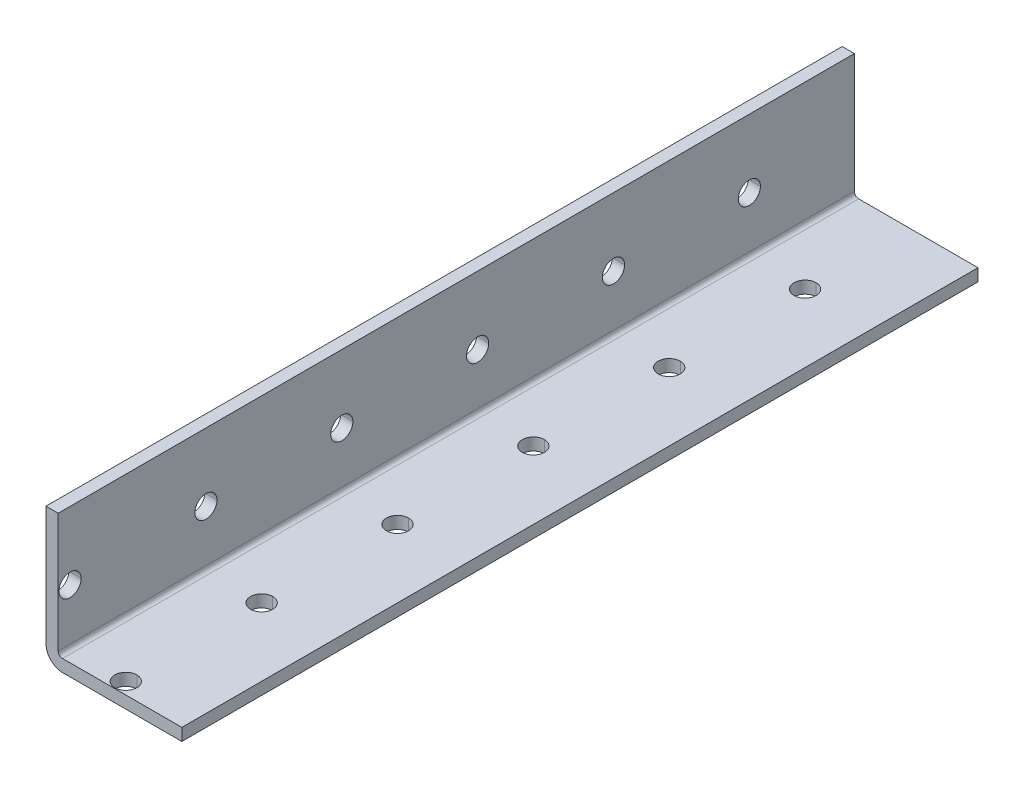
ISO-10303-21;
HEADER;
FILE_DESCRIPTION(('STEP AP214'),'2;1');
FILE_NAME('part.step','',(''),(''),'','','');
FILE_SCHEMA(('AUTOMOTIVE_DESIGN { 1 0 10303 214 1 1 1 1 }'));
ENDSEC;
DATA;
#1=APPLICATION_CONTEXT('core data for automotive mechanical design processes');
#2=APPLICATION_PROTOCOL_DEFINITION('international standard','automotive_design',2000,#1);
#3=PRODUCT_CONTEXT('',#1,'mechanical');
#4=PRODUCT('Part','Part','',(#3));
#5=PRODUCT_RELATED_PRODUCT_CATEGORY('part','',(#4));
#6=PRODUCT_DEFINITION_FORMATION('','',#4);
#7=PRODUCT_DEFINITION_CONTEXT('part definition',#1,'design');
#8=PRODUCT_DEFINITION('design','',#6,#7);
#9=PRODUCT_DEFINITION_SHAPE('','',#8);
#10=(LENGTH_UNIT() NAMED_UNIT(*) SI_UNIT(.MILLI.,.METRE.));
#11=(NAMED_UNIT(*) PLANE_ANGLE_UNIT() SI_UNIT($,.RADIAN.));
#12=(NAMED_UNIT(*) SI_UNIT($,.STERADIAN.) SOLID_ANGLE_UNIT());
#13=UNCERTAINTY_MEASURE_WITH_UNIT(LENGTH_MEASURE(1.E-05),#10,'distance_accuracy_value','');
#14=(GEOMETRIC_REPRESENTATION_CONTEXT(3) GLOBAL_UNCERTAINTY_ASSIGNED_CONTEXT((#13)) GLOBAL_UNIT_ASSIGNED_CONTEXT((#10,
#11,#12)) REPRESENTATION_CONTEXT('',''));
#15=CARTESIAN_POINT('',(0.,0.,0.));
#16=DIRECTION('',(0.,0.,1.));
#17=DIRECTION('',(1.,0.,0.));
#18=AXIS2_PLACEMENT_3D('',#15,#16,#17);
#19=CARTESIAN_POINT('',(0.,0.,749.3));
#20=DIRECTION('',(0.,-1.,0.));
#21=DIRECTION('',(0.,0.,1.));
#22=AXIS2_PLACEMENT_3D('',#19,#20,#21);
#23=PLANE('',#22);
#24=CARTESIAN_POINT('',(12.7,0.,609.6));
#25=DIRECTION('',(0.,1.,0.));
#26=DIRECTION('',(0.,0.,1.));
#27=AXIS2_PLACEMENT_3D('',#24,#25,#26);
#28=CIRCLE('',#27,2.07009999999996);
#29=CARTESIAN_POINT('',(12.7,0.,611.6701));
#30=VERTEX_POINT('',#29);
#31=CARTESIAN_POINT('',(12.7,0.,607.5299));
#32=VERTEX_POINT('',#31);
#33=EDGE_CURVE('E449',#30,#32,#28,.T.);
#34=ORIENTED_EDGE('',*,*,#33,.T.);
#35=CARTESIAN_POINT('',(12.7,0.,609.6));
#36=DIRECTION('',(0.,1.,0.));
#37=DIRECTION('',(0.,0.,1.));
#38=AXIS2_PLACEMENT_3D('',#35,#36,#37);
#39=CIRCLE('',#38,2.07009999999996);
#40=EDGE_CURVE('E402',#32,#30,#39,.T.);
#41=ORIENTED_EDGE('',*,*,#40,.T.);
#42=EDGE_LOOP('',(#34,#41));
#43=FACE_BOUND('',#42,.T.);
#44=CARTESIAN_POINT('',(12.7,0.,635.));
#45=DIRECTION('',(0.,1.,0.));
#46=DIRECTION('',(0.,0.,1.));
#47=AXIS2_PLACEMENT_3D('',#44,#45,#46);
#48=CIRCLE('',#47,2.07009999999996);
#49=CARTESIAN_POINT('',(12.7,0.,637.0701));
#50=VERTEX_POINT('',#49);
#51=CARTESIAN_POINT('',(12.7,0.,632.9299));
#52=VERTEX_POINT('',#51);
#53=EDGE_CURVE('E595',#50,#52,#48,.T.);
#54=ORIENTED_EDGE('',*,*,#53,.T.);
#55=CARTESIAN_POINT('',(12.7,0.,635.));
#56=DIRECTION('',(0.,1.,0.));
#57=DIRECTION('',(0.,0.,1.));
#58=AXIS2_PLACEMENT_3D('',#55,#56,#57);
#59=CIRCLE('',#58,2.07009999999996);
#60=EDGE_CURVE('E336',#52,#50,#59,.T.);
#61=ORIENTED_EDGE('',*,*,#60,.T.);
#62=EDGE_LOOP('',(#54,#61));
#63=FACE_BOUND('',#62,.T.);
#64=CARTESIAN_POINT('',(12.7,0.,660.4));
#65=DIRECTION('',(0.,1.,0.));
#66=DIRECTION('',(0.,0.,1.));
#67=AXIS2_PLACEMENT_3D('',#64,#65,#66);
#68=CIRCLE('',#67,2.07009999999996);
#69=CARTESIAN_POINT('',(12.7,0.,662.4701));
#70=VERTEX_POINT('',#69);
#71=CARTESIAN_POINT('',(12.7,0.,658.3299));
#72=VERTEX_POINT('',#71);
#73=EDGE_CURVE('E559',#70,#72,#68,.T.);
#74=ORIENTED_EDGE('',*,*,#73,.T.);
#75=CARTESIAN_POINT('',(12.7,0.,660.4));
#76=DIRECTION('',(0.,1.,0.));
#77=DIRECTION('',(0.,0.,1.));
#78=AXIS2_PLACEMENT_3D('',#75,#76,#77);
#79=CIRCLE('',#78,2.07009999999996);
#80=EDGE_CURVE('E434',#72,#70,#79,.T.);
#81=ORIENTED_EDGE('',*,*,#80,.T.);
#82=EDGE_LOOP('',(#74,#81));
#83=FACE_BOUND('',#82,.T.);
#84=CARTESIAN_POINT('',(12.7,0.,685.8));
#85=DIRECTION('',(0.,1.,0.));
#86=DIRECTION('',(0.,0.,1.));
#87=AXIS2_PLACEMENT_3D('',#84,#85,#86);
#88=CIRCLE('',#87,2.07009999999996);
#89=CARTESIAN_POINT('',(12.7,0.,687.8701));
#90=VERTEX_POINT('',#89);
#91=CARTESIAN_POINT('',(12.7,0.,683.7299));
#92=VERTEX_POINT('',#91);
#93=EDGE_CURVE('E560',#90,#92,#88,.T.);
#94=ORIENTED_EDGE('',*,*,#93,.T.);
#95=CARTESIAN_POINT('',(12.7,0.,685.8));
#96=DIRECTION('',(0.,1.,0.));
#97=DIRECTION('',(0.,0.,1.));
#98=AXIS2_PLACEMENT_3D('',#95,#96,#97);
#99=CIRCLE('',#98,2.07009999999996);
#100=EDGE_CURVE('E508',#92,#90,#99,.T.);
#101=ORIENTED_EDGE('',*,*,#100,.T.);
#102=EDGE_LOOP('',(#94,#101));
#103=FACE_BOUND('',#102,.T.);
#104=CARTESIAN_POINT('',(12.7,0.,711.2));
#105=DIRECTION('',(0.,1.,0.));
#106=DIRECTION('',(0.,0.,1.));
#107=AXIS2_PLACEMENT_3D('',#104,#105,#106);
#108=CIRCLE('',#107,2.07009999999996);
#109=CARTESIAN_POINT('',(12.7,0.,713.2701));
#110=VERTEX_POINT('',#109);
#111=CARTESIAN_POINT('',(12.7,0.,709.1299));
#112=VERTEX_POINT('',#111);
#113=EDGE_CURVE('E563',#110,#112,#108,.T.);
#114=ORIENTED_EDGE('',*,*,#113,.T.);
#115=CARTESIAN_POINT('',(12.7,0.,711.2));
#116=DIRECTION('',(0.,1.,0.));
#117=DIRECTION('',(0.,0.,1.));
#118=AXIS2_PLACEMENT_3D('',#115,#116,#117);
#119=CIRCLE('',#118,2.07009999999996);
#120=EDGE_CURVE('E428',#112,#110,#119,.T.);
#121=ORIENTED_EDGE('',*,*,#120,.T.);
#122=EDGE_LOOP('',(#114,#121));
#123=FACE_BOUND('',#122,.T.);
#124=CARTESIAN_POINT('',(12.7,0.,736.6));
#125=DIRECTION('',(0.,1.,0.));
#126=DIRECTION('',(0.,0.,1.));
#127=AXIS2_PLACEMENT_3D('',#124,#125,#126);
#128=CIRCLE('',#127,2.07009999999996);
#129=CARTESIAN_POINT('',(12.7,0.,738.6701));
#130=VERTEX_POINT('',#129);
#131=CARTESIAN_POINT('',(12.7,0.,734.5299));
#132=VERTEX_POINT('',#131);
#133=EDGE_CURVE('E519',#130,#132,#128,.T.);
#134=ORIENTED_EDGE('',*,*,#133,.T.);
#135=CARTESIAN_POINT('',(12.7,0.,736.6));
#136=DIRECTION('',(0.,1.,0.));
#137=DIRECTION('',(0.,0.,1.));
#138=AXIS2_PLACEMENT_3D('',#135,#136,#137);
#139=CIRCLE('',#138,2.07009999999996);
#140=EDGE_CURVE('E341',#132,#130,#139,.T.);
#141=ORIENTED_EDGE('',*,*,#140,.T.);
#142=EDGE_LOOP('',(#134,#141));
#143=FACE_BOUND('',#142,.T.);
#144=DIRECTION('',(0.,0.,-1.));
#145=VECTOR('',#144,1.);
#146=CARTESIAN_POINT('',(3.0988,0.,749.3));
#147=LINE('',#146,#145);
#148=CARTESIAN_POINT('',(3.0988,0.,738.81488));
#149=VERTEX_POINT('',#148);
#150=CARTESIAN_POINT('',(3.0988,0.,589.97088));
#151=VERTEX_POINT('',#150);
#152=EDGE_CURVE('E322',#149,#151,#147,.T.);
#153=ORIENTED_EDGE('',*,*,#152,.T.);
#154=DIRECTION('',(-1.,0.,0.));
#155=VECTOR('',#154,1.);
#156=CARTESIAN_POINT('',(0.,0.,589.97088));
#157=LINE('',#156,#155);
#158=CARTESIAN_POINT('',(25.4,0.,589.97088));
#159=VERTEX_POINT('',#158);
#160=EDGE_CURVE('E319',#159,#151,#157,.T.);
#161=ORIENTED_EDGE('',*,*,#160,.F.);
#162=DIRECTION('',(0.,0.,-1.));
#163=VECTOR('',#162,1.);
#164=CARTESIAN_POINT('',(25.4,0.,749.3));
#165=LINE('',#164,#163);
#166=CARTESIAN_POINT('',(25.4,0.,738.81488));
#167=VERTEX_POINT('',#166);
#168=EDGE_CURVE('E304',#167,#159,#165,.T.);
#169=ORIENTED_EDGE('',*,*,#168,.F.);
#170=DIRECTION('',(1.,0.,0.));
#171=VECTOR('',#170,1.);
#172=CARTESIAN_POINT('',(0.,0.,738.81488));
#173=LINE('',#172,#171);
#174=EDGE_CURVE('E310',#149,#167,#173,.T.);
#175=ORIENTED_EDGE('',*,*,#174,.F.);
#176=EDGE_LOOP('',(#153,#161,#169,#175));
#177=FACE_BOUND('',#176,.T.);
#178=ADVANCED_FACE('F50',(#43,#63,#83,#103,#123,#143,#177),#23,.T.);
#179=CARTESIAN_POINT('',(3.0988,3.0988,749.3));
#180=DIRECTION('',(0.,0.,-1.));
#181=DIRECTION('',(1.,0.,0.));
#182=AXIS2_PLACEMENT_3D('',#179,#180,#181);
#183=CYLINDRICAL_SURFACE('',#182,3.0988);
#184=DIRECTION('',(0.,0.,-1.));
#185=VECTOR('',#184,1.);
#186=CARTESIAN_POINT('',(0.,3.0988,749.3));
#187=LINE('',#186,#185);
#188=CARTESIAN_POINT('',(0.,3.0988,738.81488));
#189=VERTEX_POINT('',#188);
#190=CARTESIAN_POINT('',(0.,3.0988,589.97088));
#191=VERTEX_POINT('',#190);
#192=EDGE_CURVE('E332',#189,#191,#187,.T.);
#193=ORIENTED_EDGE('',*,*,#192,.T.);
#194=CARTESIAN_POINT('',(3.0988,3.0988,589.97088));
#195=DIRECTION('',(0.,0.,1.));
#196=DIRECTION('',(1.,0.,0.));
#197=AXIS2_PLACEMENT_3D('',#194,#195,#196);
#198=CIRCLE('',#197,3.0988);
#199=EDGE_CURVE('E1256',#151,#191,#198,.F.);
#200=ORIENTED_EDGE('',*,*,#199,.F.);
#201=ORIENTED_EDGE('',*,*,#152,.F.);
#202=CARTESIAN_POINT('',(3.0988,3.0988,738.81488));
#203=DIRECTION('',(0.,0.,-1.));
#204=DIRECTION('',(-1.,0.,0.));
#205=AXIS2_PLACEMENT_3D('',#202,#203,#204);
#206=CIRCLE('',#205,3.0988);
#207=EDGE_CURVE('E313',#189,#149,#206,.F.);
#208=ORIENTED_EDGE('',*,*,#207,.F.);
#209=EDGE_LOOP('',(#193,#200,#201,#208));
#210=FACE_BOUND('',#209,.T.);
#211=ADVANCED_FACE('F1178',(#210),#183,.T.);
#212=CARTESIAN_POINT('',(0.,0.,749.3));
#213=DIRECTION('',(-1.,0.,0.));
#214=DIRECTION('',(0.,0.,-1.));
#215=AXIS2_PLACEMENT_3D('',#212,#213,#214);
#216=PLANE('',#215);
#217=CARTESIAN_POINT('',(0.,12.7,736.6));
#218=DIRECTION('',(1.,0.,0.));
#219=DIRECTION('',(0.,0.,-1.));
#220=AXIS2_PLACEMENT_3D('',#217,#218,#219);
#221=CIRCLE('',#220,2.07009999999996);
#222=CARTESIAN_POINT('',(0.,12.7,734.5299));
#223=VERTEX_POINT('',#222);
#224=CARTESIAN_POINT('',(0.,12.7,738.6701));
#225=VERTEX_POINT('',#224);
#226=EDGE_CURVE('E448',#223,#225,#221,.T.);
#227=ORIENTED_EDGE('',*,*,#226,.T.);
#228=CARTESIAN_POINT('',(0.,12.7,736.6));
#229=DIRECTION('',(1.,0.,0.));
#230=DIRECTION('',(0.,0.,-1.));
#231=AXIS2_PLACEMENT_3D('',#228,#229,#230);
#232=CIRCLE('',#231,2.07009999999996);
#233=EDGE_CURVE('E387',#225,#223,#232,.T.);
#234=ORIENTED_EDGE('',*,*,#233,.T.);
#235=EDGE_LOOP('',(#227,#234));
#236=FACE_BOUND('',#235,.T.);
#237=CARTESIAN_POINT('',(0.,12.7,711.2));
#238=DIRECTION('',(1.,0.,0.));
#239=DIRECTION('',(0.,0.,-1.));
#240=AXIS2_PLACEMENT_3D('',#237,#238,#239);
#241=CIRCLE('',#240,2.07009999999996);
#242=CARTESIAN_POINT('',(0.,12.7,709.1299));
#243=VERTEX_POINT('',#242);
#244=CARTESIAN_POINT('',(0.,12.7,713.2701));
#245=VERTEX_POINT('',#244);
#246=EDGE_CURVE('E447',#243,#245,#241,.T.);
#247=ORIENTED_EDGE('',*,*,#246,.T.);
#248=CARTESIAN_POINT('',(0.,12.7,711.2));
#249=DIRECTION('',(1.,0.,0.));
#250=DIRECTION('',(0.,0.,-1.));
#251=AXIS2_PLACEMENT_3D('',#248,#249,#250);
#252=CIRCLE('',#251,2.07009999999996);
#253=EDGE_CURVE('E472',#245,#243,#252,.T.);
#254=ORIENTED_EDGE('',*,*,#253,.T.);
#255=EDGE_LOOP('',(#247,#254));
#256=FACE_BOUND('',#255,.T.);
#257=CARTESIAN_POINT('',(0.,12.7,685.8));
#258=DIRECTION('',(1.,0.,0.));
#259=DIRECTION('',(0.,0.,-1.));
#260=AXIS2_PLACEMENT_3D('',#257,#258,#259);
#261=CIRCLE('',#260,2.07009999999996);
#262=CARTESIAN_POINT('',(0.,12.7,683.7299));
#263=VERTEX_POINT('',#262);
#264=CARTESIAN_POINT('',(0.,12.7,687.8701));
#265=VERTEX_POINT('',#264);
#266=EDGE_CURVE('E354',#263,#265,#261,.T.);
#267=ORIENTED_EDGE('',*,*,#266,.T.);
#268=CARTESIAN_POINT('',(0.,12.7,685.8));
#269=DIRECTION('',(1.,0.,0.));
#270=DIRECTION('',(0.,0.,-1.));
#271=AXIS2_PLACEMENT_3D('',#268,#269,#270);
#272=CIRCLE('',#271,2.07009999999996);
#273=EDGE_CURVE('E540',#265,#263,#272,.T.);
#274=ORIENTED_EDGE('',*,*,#273,.T.);
#275=EDGE_LOOP('',(#267,#274));
#276=FACE_BOUND('',#275,.T.);
#277=CARTESIAN_POINT('',(0.,12.7,660.4));
#278=DIRECTION('',(1.,0.,0.));
#279=DIRECTION('',(0.,0.,-1.));
#280=AXIS2_PLACEMENT_3D('',#277,#278,#279);
#281=CIRCLE('',#280,2.07009999999996);
#282=CARTESIAN_POINT('',(0.,12.7,658.3299));
#283=VERTEX_POINT('',#282);
#284=CARTESIAN_POINT('',(0.,12.7,662.4701));
#285=VERTEX_POINT('',#284);
#286=EDGE_CURVE('E395',#283,#285,#281,.T.);
#287=ORIENTED_EDGE('',*,*,#286,.T.);
#288=CARTESIAN_POINT('',(0.,12.7,660.4));
#289=DIRECTION('',(1.,0.,0.));
#290=DIRECTION('',(0.,0.,-1.));
#291=AXIS2_PLACEMENT_3D('',#288,#289,#290);
#292=CIRCLE('',#291,2.07009999999996);
#293=EDGE_CURVE('E495',#285,#283,#292,.T.);
#294=ORIENTED_EDGE('',*,*,#293,.T.);
#295=EDGE_LOOP('',(#287,#294));
#296=FACE_BOUND('',#295,.T.);
#297=CARTESIAN_POINT('',(0.,12.7,635.));
#298=DIRECTION('',(1.,0.,0.));
#299=DIRECTION('',(0.,0.,-1.));
#300=AXIS2_PLACEMENT_3D('',#297,#298,#299);
#301=CIRCLE('',#300,2.07009999999996);
#302=CARTESIAN_POINT('',(0.,12.7,632.9299));
#303=VERTEX_POINT('',#302);
#304=CARTESIAN_POINT('',(0.,12.7,637.0701));
#305=VERTEX_POINT('',#304);
#306=EDGE_CURVE('E348',#303,#305,#301,.T.);
#307=ORIENTED_EDGE('',*,*,#306,.T.);
#308=CARTESIAN_POINT('',(0.,12.7,635.));
#309=DIRECTION('',(1.,0.,0.));
#310=DIRECTION('',(0.,0.,-1.));
#311=AXIS2_PLACEMENT_3D('',#308,#309,#310);
#312=CIRCLE('',#311,2.07009999999996);
#313=EDGE_CURVE('E429',#305,#303,#312,.T.);
#314=ORIENTED_EDGE('',*,*,#313,.T.);
#315=EDGE_LOOP('',(#307,#314));
#316=FACE_BOUND('',#315,.T.);
#317=CARTESIAN_POINT('',(0.,12.7,609.6));
#318=DIRECTION('',(1.,0.,0.));
#319=DIRECTION('',(0.,0.,-1.));
#320=AXIS2_PLACEMENT_3D('',#317,#318,#319);
#321=CIRCLE('',#320,2.07009999999996);
#322=CARTESIAN_POINT('',(0.,12.7,607.5299));
#323=VERTEX_POINT('',#322);
#324=CARTESIAN_POINT('',(0.,12.7,611.6701));
#325=VERTEX_POINT('',#324);
#326=EDGE_CURVE('E420',#323,#325,#321,.T.);
#327=ORIENTED_EDGE('',*,*,#326,.T.);
#328=CARTESIAN_POINT('',(0.,12.7,609.6));
#329=DIRECTION('',(1.,0.,0.));
#330=DIRECTION('',(0.,0.,-1.));
#331=AXIS2_PLACEMENT_3D('',#328,#329,#330);
#332=CIRCLE('',#331,2.07009999999996);
#333=EDGE_CURVE('E321',#325,#323,#332,.T.);
#334=ORIENTED_EDGE('',*,*,#333,.T.);
#335=EDGE_LOOP('',(#327,#334));
#336=FACE_BOUND('',#335,.T.);
#337=DIRECTION('',(0.,0.,-1.));
#338=VECTOR('',#337,1.);
#339=CARTESIAN_POINT('',(0.,25.4,749.3));
#340=LINE('',#339,#338);
#341=CARTESIAN_POINT('',(0.,25.4,738.81488));
#342=VERTEX_POINT('',#341);
#343=CARTESIAN_POINT('',(0.,25.4,589.97088));
#344=VERTEX_POINT('',#343);
#345=EDGE_CURVE('E464',#342,#344,#340,.T.);
#346=ORIENTED_EDGE('',*,*,#345,.T.);
#347=DIRECTION('',(0.,1.,0.));
#348=VECTOR('',#347,1.);
#349=CARTESIAN_POINT('',(0.,0.,589.97088));
#350=LINE('',#349,#348);
#351=EDGE_CURVE('E1253',#191,#344,#350,.T.);
#352=ORIENTED_EDGE('',*,*,#351,.F.);
#353=ORIENTED_EDGE('',*,*,#192,.F.);
#354=DIRECTION('',(0.,-1.,0.));
#355=VECTOR('',#354,1.);
#356=CARTESIAN_POINT('',(0.,0.,738.81488));
#357=LINE('',#356,#355);
#358=EDGE_CURVE('E1240',#342,#189,#357,.T.);
#359=ORIENTED_EDGE('',*,*,#358,.F.);
#360=EDGE_LOOP('',(#346,#352,#353,#359));
#361=FACE_BOUND('',#360,.T.);
#362=ADVANCED_FACE('F1183',(#236,#256,#276,#296,#316,#336,#361),#216,.T.);
#363=CARTESIAN_POINT('',(0.,25.4,749.3));
#364=DIRECTION('',(0.,-1.,0.));
#365=DIRECTION('',(0.,0.,1.));
#366=AXIS2_PLACEMENT_3D('',#363,#364,#365);
#367=PLANE('',#366);
#368=DIRECTION('',(1.,0.,0.));
#369=VECTOR('',#368,1.);
#370=CARTESIAN_POINT('',(0.,25.4,738.81488));
#371=LINE('',#370,#369);
#372=CARTESIAN_POINT('',(2.286,25.4,738.81488));
#373=VERTEX_POINT('',#372);
#374=EDGE_CURVE('E1237',#342,#373,#371,.T.);
#375=ORIENTED_EDGE('',*,*,#374,.T.);
#376=DIRECTION('',(0.,0.,-1.));
#377=VECTOR('',#376,1.);
#378=CARTESIAN_POINT('',(2.286,25.4,749.3));
#379=LINE('',#378,#377);
#380=CARTESIAN_POINT('',(2.286,25.4,589.97088));
#381=VERTEX_POINT('',#380);
#382=EDGE_CURVE('E468',#373,#381,#379,.T.);
#383=ORIENTED_EDGE('',*,*,#382,.T.);
#384=DIRECTION('',(-1.,0.,0.));
#385=VECTOR('',#384,1.);
#386=CARTESIAN_POINT('',(0.,25.4,589.97088));
#387=LINE('',#386,#385);
#388=EDGE_CURVE('E1251',#381,#344,#387,.T.);
#389=ORIENTED_EDGE('',*,*,#388,.T.);
#390=ORIENTED_EDGE('',*,*,#345,.F.);
#391=EDGE_LOOP('',(#375,#383,#389,#390));
#392=FACE_BOUND('',#391,.T.);
#393=ADVANCED_FACE('F1206',(#392),#367,.F.);
#394=CARTESIAN_POINT('',(2.286,0.,749.3));
#395=DIRECTION('',(-1.,0.,0.));
#396=DIRECTION('',(0.,0.,-1.));
#397=AXIS2_PLACEMENT_3D('',#394,#395,#396);
#398=PLANE('',#397);
#399=CARTESIAN_POINT('',(2.286,12.7,609.6));
#400=DIRECTION('',(1.,0.,0.));
#401=DIRECTION('',(0.,0.,-1.));
#402=AXIS2_PLACEMENT_3D('',#399,#400,#401);
#403=CIRCLE('',#402,2.07009999999996);
#404=CARTESIAN_POINT('',(2.286,12.7,607.5299));
#405=VERTEX_POINT('',#404);
#406=CARTESIAN_POINT('',(2.286,12.7,611.6701));
#407=VERTEX_POINT('',#406);
#408=EDGE_CURVE('E530',#405,#407,#403,.T.);
#409=ORIENTED_EDGE('',*,*,#408,.F.);
#410=CARTESIAN_POINT('',(2.286,12.7,609.6));
#411=DIRECTION('',(1.,0.,0.));
#412=DIRECTION('',(0.,0.,-1.));
#413=AXIS2_PLACEMENT_3D('',#410,#411,#412);
#414=CIRCLE('',#413,2.07009999999996);
#415=EDGE_CURVE('E526',#407,#405,#414,.T.);
#416=ORIENTED_EDGE('',*,*,#415,.F.);
#417=EDGE_LOOP('',(#409,#416));
#418=FACE_BOUND('',#417,.T.);
#419=CARTESIAN_POINT('',(2.286,12.7,635.));
#420=DIRECTION('',(1.,0.,0.));
#421=DIRECTION('',(0.,0.,-1.));
#422=AXIS2_PLACEMENT_3D('',#419,#420,#421);
#423=CIRCLE('',#422,2.07009999999996);
#424=CARTESIAN_POINT('',(2.286,12.7,632.9299));
#425=VERTEX_POINT('',#424);
#426=CARTESIAN_POINT('',(2.286,12.7,637.0701));
#427=VERTEX_POINT('',#426);
#428=EDGE_CURVE('E376',#425,#427,#423,.T.);
#429=ORIENTED_EDGE('',*,*,#428,.F.);
#430=CARTESIAN_POINT('',(2.286,12.7,635.));
#431=DIRECTION('',(1.,0.,0.));
#432=DIRECTION('',(0.,0.,-1.));
#433=AXIS2_PLACEMENT_3D('',#430,#431,#432);
#434=CIRCLE('',#433,2.07009999999996);
#435=EDGE_CURVE('E372',#427,#425,#434,.T.);
#436=ORIENTED_EDGE('',*,*,#435,.F.);
#437=EDGE_LOOP('',(#429,#436));
#438=FACE_BOUND('',#437,.T.);
#439=CARTESIAN_POINT('',(2.286,12.7,660.4));
#440=DIRECTION('',(1.,0.,0.));
#441=DIRECTION('',(0.,0.,-1.));
#442=AXIS2_PLACEMENT_3D('',#439,#440,#441);
#443=CIRCLE('',#442,2.07009999999996);
#444=CARTESIAN_POINT('',(2.286,12.7,658.3299));
#445=VERTEX_POINT('',#444);
#446=CARTESIAN_POINT('',(2.286,12.7,662.4701));
#447=VERTEX_POINT('',#446);
#448=EDGE_CURVE('E377',#445,#447,#443,.T.);
#449=ORIENTED_EDGE('',*,*,#448,.F.);
#450=CARTESIAN_POINT('',(2.286,12.7,660.4));
#451=DIRECTION('',(1.,0.,0.));
#452=DIRECTION('',(0.,0.,-1.));
#453=AXIS2_PLACEMENT_3D('',#450,#451,#452);
#454=CIRCLE('',#453,2.07009999999996);
#455=EDGE_CURVE('E443',#447,#445,#454,.T.);
#456=ORIENTED_EDGE('',*,*,#455,.F.);
#457=EDGE_LOOP('',(#449,#456));
#458=FACE_BOUND('',#457,.T.);
#459=CARTESIAN_POINT('',(2.286,12.7,685.8));
#460=DIRECTION('',(1.,0.,0.));
#461=DIRECTION('',(0.,0.,-1.));
#462=AXIS2_PLACEMENT_3D('',#459,#460,#461);
#463=CIRCLE('',#462,2.07009999999996);
#464=CARTESIAN_POINT('',(2.286,12.7,683.7299));
#465=VERTEX_POINT('',#464);
#466=CARTESIAN_POINT('',(2.286,12.7,687.8701));
#467=VERTEX_POINT('',#466);
#468=EDGE_CURVE('E455',#465,#467,#463,.T.);
#469=ORIENTED_EDGE('',*,*,#468,.F.);
#470=CARTESIAN_POINT('',(2.286,12.7,685.8));
#471=DIRECTION('',(1.,0.,0.));
#472=DIRECTION('',(0.,0.,-1.));
#473=AXIS2_PLACEMENT_3D('',#470,#471,#472);
#474=CIRCLE('',#473,2.07009999999996);
#475=EDGE_CURVE('E459',#467,#465,#474,.T.);
#476=ORIENTED_EDGE('',*,*,#475,.F.);
#477=EDGE_LOOP('',(#469,#476));
#478=FACE_BOUND('',#477,.T.);
#479=CARTESIAN_POINT('',(2.286,12.7,711.2));
#480=DIRECTION('',(1.,0.,0.));
#481=DIRECTION('',(0.,0.,-1.));
#482=AXIS2_PLACEMENT_3D('',#479,#480,#481);
#483=CIRCLE('',#482,2.07009999999996);
#484=CARTESIAN_POINT('',(2.286,12.7,709.1299));
#485=VERTEX_POINT('',#484);
#486=CARTESIAN_POINT('',(2.286,12.7,713.2701));
#487=VERTEX_POINT('',#486);
#488=EDGE_CURVE('E494',#485,#487,#483,.T.);
#489=ORIENTED_EDGE('',*,*,#488,.F.);
#490=CARTESIAN_POINT('',(2.286,12.7,711.2));
#491=DIRECTION('',(1.,0.,0.));
#492=DIRECTION('',(0.,0.,-1.));
#493=AXIS2_PLACEMENT_3D('',#490,#491,#492);
#494=CIRCLE('',#493,2.07009999999996);
#495=EDGE_CURVE('E364',#487,#485,#494,.T.);
#496=ORIENTED_EDGE('',*,*,#495,.F.);
#497=EDGE_LOOP('',(#489,#496));
#498=FACE_BOUND('',#497,.T.);
#499=CARTESIAN_POINT('',(2.286,12.7,736.6));
#500=DIRECTION('',(1.,0.,0.));
#501=DIRECTION('',(0.,0.,-1.));
#502=AXIS2_PLACEMENT_3D('',#499,#500,#501);
#503=CIRCLE('',#502,2.07009999999996);
#504=CARTESIAN_POINT('',(2.286,12.7,734.5299));
#505=VERTEX_POINT('',#504);
#506=CARTESIAN_POINT('',(2.286,12.7,738.6701));
#507=VERTEX_POINT('',#506);
#508=EDGE_CURVE('E360',#505,#507,#503,.T.);
#509=ORIENTED_EDGE('',*,*,#508,.F.);
#510=CARTESIAN_POINT('',(2.286,12.7,736.6));
#511=DIRECTION('',(1.,0.,0.));
#512=DIRECTION('',(0.,0.,-1.));
#513=AXIS2_PLACEMENT_3D('',#510,#511,#512);
#514=CIRCLE('',#513,2.07009999999996);
#515=EDGE_CURVE('E365',#507,#505,#514,.T.);
#516=ORIENTED_EDGE('',*,*,#515,.F.);
#517=EDGE_LOOP('',(#509,#516));
#518=FACE_BOUND('',#517,.T.);
#519=DIRECTION('',(0.,-1.,0.));
#520=VECTOR('',#519,1.);
#521=CARTESIAN_POINT('',(2.286,0.,738.81488));
#522=LINE('',#521,#520);
#523=CARTESIAN_POINT('',(2.286,3.0988,738.81488));
#524=VERTEX_POINT('',#523);
#525=EDGE_CURVE('E1234',#373,#524,#522,.T.);
#526=ORIENTED_EDGE('',*,*,#525,.T.);
#527=DIRECTION('',(0.,0.,-1.));
#528=VECTOR('',#527,1.);
#529=CARTESIAN_POINT('',(2.286,3.0988,749.3));
#530=LINE('',#529,#528);
#531=CARTESIAN_POINT('',(2.286,3.0988,589.97088));
#532=VERTEX_POINT('',#531);
#533=EDGE_CURVE('E400',#524,#532,#530,.T.);
#534=ORIENTED_EDGE('',*,*,#533,.T.);
#535=DIRECTION('',(0.,1.,0.));
#536=VECTOR('',#535,1.);
#537=CARTESIAN_POINT('',(2.286,0.,589.97088));
#538=LINE('',#537,#536);
#539=EDGE_CURVE('E1249',#532,#381,#538,.T.);
#540=ORIENTED_EDGE('',*,*,#539,.T.);
#541=ORIENTED_EDGE('',*,*,#382,.F.);
#542=EDGE_LOOP('',(#526,#534,#540,#541));
#543=FACE_BOUND('',#542,.T.);
#544=ADVANCED_FACE('F1200',(#418,#438,#458,#478,#498,#518,#543),#398,.F.);
#545=CARTESIAN_POINT('',(3.0988,3.0988,749.3));
#546=DIRECTION('',(0.,0.,-1.));
#547=DIRECTION('',(1.,0.,0.));
#548=AXIS2_PLACEMENT_3D('',#545,#546,#547);
#549=CYLINDRICAL_SURFACE('',#548,0.8128);
#550=CARTESIAN_POINT('',(3.0988,3.0988,738.81488));
#551=DIRECTION('',(0.,0.,-1.));
#552=DIRECTION('',(-1.,0.,0.));
#553=AXIS2_PLACEMENT_3D('',#550,#551,#552);
#554=CIRCLE('',#553,0.8128);
#555=CARTESIAN_POINT('',(3.0988,2.286,738.81488));
#556=VERTEX_POINT('',#555);
#557=EDGE_CURVE('E1238',#524,#556,#554,.F.);
#558=ORIENTED_EDGE('',*,*,#557,.T.);
#559=DIRECTION('',(0.,0.,-1.));
#560=VECTOR('',#559,1.);
#561=CARTESIAN_POINT('',(3.0988,2.286,749.3));
#562=LINE('',#561,#560);
#563=CARTESIAN_POINT('',(3.0988,2.286,589.97088));
#564=VERTEX_POINT('',#563);
#565=EDGE_CURVE('E396',#556,#564,#562,.T.);
#566=ORIENTED_EDGE('',*,*,#565,.T.);
#567=CARTESIAN_POINT('',(3.0988,3.0988,589.97088));
#568=DIRECTION('',(0.,0.,1.));
#569=DIRECTION('',(1.,0.,0.));
#570=AXIS2_PLACEMENT_3D('',#567,#568,#569);
#571=CIRCLE('',#570,0.8128);
#572=EDGE_CURVE('E409',#564,#532,#571,.F.);
#573=ORIENTED_EDGE('',*,*,#572,.T.);
#574=ORIENTED_EDGE('',*,*,#533,.F.);
#575=EDGE_LOOP('',(#558,#566,#573,#574));
#576=FACE_BOUND('',#575,.T.);
#577=ADVANCED_FACE('F1192',(#576),#549,.F.);
#578=CARTESIAN_POINT('',(0.,2.286,749.3));
#579=DIRECTION('',(0.,-1.,0.));
#580=DIRECTION('',(0.,0.,1.));
#581=AXIS2_PLACEMENT_3D('',#578,#579,#580);
#582=PLANE('',#581);
#583=CARTESIAN_POINT('',(12.7,2.286,736.6));
#584=DIRECTION('',(0.,1.,0.));
#585=DIRECTION('',(0.,0.,1.));
#586=AXIS2_PLACEMENT_3D('',#583,#584,#585);
#587=CIRCLE('',#586,2.07009999999996);
#588=CARTESIAN_POINT('',(12.7,2.286,738.6701));
#589=VERTEX_POINT('',#588);
#590=CARTESIAN_POINT('',(12.7,2.286,734.5299));
#591=VERTEX_POINT('',#590);
#592=EDGE_CURVE('E401',#589,#591,#587,.T.);
#593=ORIENTED_EDGE('',*,*,#592,.F.);
#594=CARTESIAN_POINT('',(12.7,2.286,736.6));
#595=DIRECTION('',(0.,1.,0.));
#596=DIRECTION('',(0.,0.,1.));
#597=AXIS2_PLACEMENT_3D('',#594,#595,#596);
#598=CIRCLE('',#597,2.07009999999996);
#599=EDGE_CURVE('E484',#591,#589,#598,.T.);
#600=ORIENTED_EDGE('',*,*,#599,.F.);
#601=EDGE_LOOP('',(#593,#600));
#602=FACE_BOUND('',#601,.T.);
#603=CARTESIAN_POINT('',(12.7,2.286,711.2));
#604=DIRECTION('',(0.,1.,0.));
#605=DIRECTION('',(0.,0.,1.));
#606=AXIS2_PLACEMENT_3D('',#603,#604,#605);
#607=CIRCLE('',#606,2.07009999999996);
#608=CARTESIAN_POINT('',(12.7,2.286,713.2701));
#609=VERTEX_POINT('',#608);
#610=CARTESIAN_POINT('',(12.7,2.286,709.1299));
#611=VERTEX_POINT('',#610);
#612=EDGE_CURVE('E382',#609,#611,#607,.T.);
#613=ORIENTED_EDGE('',*,*,#612,.F.);
#614=CARTESIAN_POINT('',(12.7,2.286,711.2));
#615=DIRECTION('',(0.,1.,0.));
#616=DIRECTION('',(0.,0.,1.));
#617=AXIS2_PLACEMENT_3D('',#614,#615,#616);
#618=CIRCLE('',#617,2.07009999999996);
#619=EDGE_CURVE('E378',#611,#609,#618,.T.);
#620=ORIENTED_EDGE('',*,*,#619,.F.);
#621=EDGE_LOOP('',(#613,#620));
#622=FACE_BOUND('',#621,.T.);
#623=CARTESIAN_POINT('',(12.7,2.286,685.8));
#624=DIRECTION('',(0.,1.,0.));
#625=DIRECTION('',(0.,0.,1.));
#626=AXIS2_PLACEMENT_3D('',#623,#624,#625);
#627=CIRCLE('',#626,2.07009999999996);
#628=CARTESIAN_POINT('',(12.7,2.286,687.8701));
#629=VERTEX_POINT('',#628);
#630=CARTESIAN_POINT('',(12.7,2.286,683.7299));
#631=VERTEX_POINT('',#630);
#632=EDGE_CURVE('E383',#629,#631,#627,.T.);
#633=ORIENTED_EDGE('',*,*,#632,.F.);
#634=CARTESIAN_POINT('',(12.7,2.286,685.8));
#635=DIRECTION('',(0.,1.,0.));
#636=DIRECTION('',(0.,0.,1.));
#637=AXIS2_PLACEMENT_3D('',#634,#635,#636);
#638=CIRCLE('',#637,2.07009999999996);
#639=EDGE_CURVE('E370',#631,#629,#638,.T.);
#640=ORIENTED_EDGE('',*,*,#639,.F.);
#641=EDGE_LOOP('',(#633,#640));
#642=FACE_BOUND('',#641,.T.);
#643=CARTESIAN_POINT('',(12.7,2.286,660.4));
#644=DIRECTION('',(0.,1.,0.));
#645=DIRECTION('',(0.,0.,1.));
#646=AXIS2_PLACEMENT_3D('',#643,#644,#645);
#647=CIRCLE('',#646,2.07009999999996);
#648=CARTESIAN_POINT('',(12.7,2.286,662.4701));
#649=VERTEX_POINT('',#648);
#650=CARTESIAN_POINT('',(12.7,2.286,658.3299));
#651=VERTEX_POINT('',#650);
#652=EDGE_CURVE('E366',#649,#651,#647,.T.);
#653=ORIENTED_EDGE('',*,*,#652,.F.);
#654=CARTESIAN_POINT('',(12.7,2.286,660.4));
#655=DIRECTION('',(0.,1.,0.));
#656=DIRECTION('',(0.,0.,1.));
#657=AXIS2_PLACEMENT_3D('',#654,#655,#656);
#658=CIRCLE('',#657,2.07009999999996);
#659=EDGE_CURVE('E371',#651,#649,#658,.T.);
#660=ORIENTED_EDGE('',*,*,#659,.F.);
#661=EDGE_LOOP('',(#653,#660));
#662=FACE_BOUND('',#661,.T.);
#663=CARTESIAN_POINT('',(12.7,2.286,635.));
#664=DIRECTION('',(0.,1.,0.));
#665=DIRECTION('',(0.,0.,1.));
#666=AXIS2_PLACEMENT_3D('',#663,#664,#665);
#667=CIRCLE('',#666,2.07009999999996);
#668=CARTESIAN_POINT('',(12.7,2.286,637.0701));
#669=VERTEX_POINT('',#668);
#670=CARTESIAN_POINT('',(12.7,2.286,632.9299));
#671=VERTEX_POINT('',#670);
#672=EDGE_CURVE('E463',#669,#671,#667,.T.);
#673=ORIENTED_EDGE('',*,*,#672,.F.);
#674=CARTESIAN_POINT('',(12.7,2.286,635.));
#675=DIRECTION('',(0.,1.,0.));
#676=DIRECTION('',(0.,0.,1.));
#677=AXIS2_PLACEMENT_3D('',#674,#675,#676);
#678=CIRCLE('',#677,2.07009999999996);
#679=EDGE_CURVE('E346',#671,#669,#678,.T.);
#680=ORIENTED_EDGE('',*,*,#679,.F.);
#681=EDGE_LOOP('',(#673,#680));
#682=FACE_BOUND('',#681,.T.);
#683=CARTESIAN_POINT('',(12.7,2.286,609.6));
#684=DIRECTION('',(0.,1.,0.));
#685=DIRECTION('',(0.,0.,1.));
#686=AXIS2_PLACEMENT_3D('',#683,#684,#685);
#687=CIRCLE('',#686,2.07009999999996);
#688=CARTESIAN_POINT('',(12.7,2.286,611.6701));
#689=VERTEX_POINT('',#688);
#690=CARTESIAN_POINT('',(12.7,2.286,607.5299));
#691=VERTEX_POINT('',#690);
#692=EDGE_CURVE('E342',#689,#691,#687,.T.);
#693=ORIENTED_EDGE('',*,*,#692,.F.);
#694=CARTESIAN_POINT('',(12.7,2.286,609.6));
#695=DIRECTION('',(0.,1.,0.));
#696=DIRECTION('',(0.,0.,1.));
#697=AXIS2_PLACEMENT_3D('',#694,#695,#696);
#698=CIRCLE('',#697,2.07009999999996);
#699=EDGE_CURVE('E347',#691,#689,#698,.T.);
#700=ORIENTED_EDGE('',*,*,#699,.F.);
#701=EDGE_LOOP('',(#693,#700));
#702=FACE_BOUND('',#701,.T.);
#703=DIRECTION('',(1.,0.,0.));
#704=VECTOR('',#703,1.);
#705=CARTESIAN_POINT('',(0.,2.286,738.81488));
#706=LINE('',#705,#704);
#707=CARTESIAN_POINT('',(25.4,2.286,738.81488));
#708=VERTEX_POINT('',#707);
#709=EDGE_CURVE('E414',#556,#708,#706,.T.);
#710=ORIENTED_EDGE('',*,*,#709,.T.);
#711=DIRECTION('',(0.,0.,-1.));
#712=VECTOR('',#711,1.);
#713=CARTESIAN_POINT('',(25.4,2.286,749.3));
#714=LINE('',#713,#712);
#715=CARTESIAN_POINT('',(25.4,2.286,589.97088));
#716=VERTEX_POINT('',#715);
#717=EDGE_CURVE('E307',#708,#716,#714,.T.);
#718=ORIENTED_EDGE('',*,*,#717,.T.);
#719=DIRECTION('',(-1.,0.,0.));
#720=VECTOR('',#719,1.);
#721=CARTESIAN_POINT('',(0.,2.286,589.97088));
#722=LINE('',#721,#720);
#723=EDGE_CURVE('E317',#716,#564,#722,.T.);
#724=ORIENTED_EDGE('',*,*,#723,.T.);
#725=ORIENTED_EDGE('',*,*,#565,.F.);
#726=EDGE_LOOP('',(#710,#718,#724,#725));
#727=FACE_BOUND('',#726,.T.);
#728=ADVANCED_FACE('F413',(#602,#622,#642,#662,#682,#702,#727),#582,.F.);
#729=CARTESIAN_POINT('',(25.4,2.286,749.3));
#730=DIRECTION('',(-1.,0.,0.));
#731=DIRECTION('',(0.,0.,-1.));
#732=AXIS2_PLACEMENT_3D('',#729,#730,#731);
#733=PLANE('',#732);
#734=DIRECTION('',(0.,-1.,0.));
#735=VECTOR('',#734,1.);
#736=CARTESIAN_POINT('',(25.4,2.286,738.81488));
#737=LINE('',#736,#735);
#738=EDGE_CURVE('E12',#708,#167,#737,.T.);
#739=ORIENTED_EDGE('',*,*,#738,.T.);
#740=ORIENTED_EDGE('',*,*,#168,.T.);
#741=DIRECTION('',(0.,1.,0.));
#742=VECTOR('',#741,1.);
#743=CARTESIAN_POINT('',(25.4,2.286,589.97088));
#744=LINE('',#743,#742);
#745=EDGE_CURVE('E57',#159,#716,#744,.T.);
#746=ORIENTED_EDGE('',*,*,#745,.T.);
#747=ORIENTED_EDGE('',*,*,#717,.F.);
#748=EDGE_LOOP('',(#739,#740,#746,#747));
#749=FACE_BOUND('',#748,.T.);
#750=ADVANCED_FACE('F302',(#749),#733,.F.);
#751=CARTESIAN_POINT('',(12.7,25.4,736.6));
#752=DIRECTION('',(0.,-1.,0.));
#753=DIRECTION('',(0.,0.,1.));
#754=AXIS2_PLACEMENT_3D('',#751,#752,#753);
#755=CYLINDRICAL_SURFACE('',#754,2.07009999999996);
#756=ORIENTED_EDGE('',*,*,#599,.T.);
#757=DIRECTION('',(0.,-1.,0.));
#758=VECTOR('',#757,1.);
#759=CARTESIAN_POINT('',(12.7,25.4,738.6701));
#760=LINE('',#759,#758);
#761=EDGE_CURVE('E523',#589,#130,#760,.T.);
#762=ORIENTED_EDGE('',*,*,#761,.T.);
#763=ORIENTED_EDGE('',*,*,#140,.F.);
#764=DIRECTION('',(0.,-1.,0.));
#765=VECTOR('',#764,1.);
#766=CARTESIAN_POINT('',(12.7,25.4,734.5299));
#767=LINE('',#766,#765);
#768=EDGE_CURVE('E338',#591,#132,#767,.T.);
#769=ORIENTED_EDGE('',*,*,#768,.F.);
#770=EDGE_LOOP('',(#756,#762,#763,#769));
#771=FACE_BOUND('',#770,.T.);
#772=ADVANCED_FACE('F872',(#771),#755,.F.);
#773=CARTESIAN_POINT('',(12.7,25.4,711.2));
#774=DIRECTION('',(0.,-1.,0.));
#775=DIRECTION('',(0.,0.,1.));
#776=AXIS2_PLACEMENT_3D('',#773,#774,#775);
#777=CYLINDRICAL_SURFACE('',#776,2.07009999999996);
#778=ORIENTED_EDGE('',*,*,#619,.T.);
#779=DIRECTION('',(0.,-1.,0.));
#780=VECTOR('',#779,1.);
#781=CARTESIAN_POINT('',(12.7,25.4,713.2701));
#782=LINE('',#781,#780);
#783=EDGE_CURVE('E567',#609,#110,#782,.T.);
#784=ORIENTED_EDGE('',*,*,#783,.T.);
#785=ORIENTED_EDGE('',*,*,#120,.F.);
#786=DIRECTION('',(0.,-1.,0.));
#787=VECTOR('',#786,1.);
#788=CARTESIAN_POINT('',(12.7,25.4,709.1299));
#789=LINE('',#788,#787);
#790=EDGE_CURVE('E425',#611,#112,#789,.T.);
#791=ORIENTED_EDGE('',*,*,#790,.F.);
#792=EDGE_LOOP('',(#778,#784,#785,#791));
#793=FACE_BOUND('',#792,.T.);
#794=ADVANCED_FACE('F877',(#793),#777,.F.);
#795=CARTESIAN_POINT('',(12.7,25.4,685.8));
#796=DIRECTION('',(0.,-1.,0.));
#797=DIRECTION('',(0.,0.,1.));
#798=AXIS2_PLACEMENT_3D('',#795,#796,#797);
#799=CYLINDRICAL_SURFACE('',#798,2.07009999999996);
#800=ORIENTED_EDGE('',*,*,#639,.T.);
#801=DIRECTION('',(0.,-1.,0.));
#802=VECTOR('',#801,1.);
#803=CARTESIAN_POINT('',(12.7,25.4,687.8701));
#804=LINE('',#803,#802);
#805=EDGE_CURVE('E556',#629,#90,#804,.T.);
#806=ORIENTED_EDGE('',*,*,#805,.T.);
#807=ORIENTED_EDGE('',*,*,#100,.F.);
#808=DIRECTION('',(0.,-1.,0.));
#809=VECTOR('',#808,1.);
#810=CARTESIAN_POINT('',(12.7,25.4,683.7299));
#811=LINE('',#810,#809);
#812=EDGE_CURVE('E480',#631,#92,#811,.T.);
#813=ORIENTED_EDGE('',*,*,#812,.F.);
#814=EDGE_LOOP('',(#800,#806,#807,#813));
#815=FACE_BOUND('',#814,.T.);
#816=ADVANCED_FACE('F733',(#815),#799,.F.);
#817=CARTESIAN_POINT('',(12.7,25.4,660.4));
#818=DIRECTION('',(0.,-1.,0.));
#819=DIRECTION('',(0.,0.,1.));
#820=AXIS2_PLACEMENT_3D('',#817,#818,#819);
#821=CYLINDRICAL_SURFACE('',#820,2.07009999999996);
#822=ORIENTED_EDGE('',*,*,#659,.T.);
#823=DIRECTION('',(0.,-1.,0.));
#824=VECTOR('',#823,1.);
#825=CARTESIAN_POINT('',(12.7,25.4,662.4701));
#826=LINE('',#825,#824);
#827=EDGE_CURVE('E592',#649,#70,#826,.T.);
#828=ORIENTED_EDGE('',*,*,#827,.T.);
#829=ORIENTED_EDGE('',*,*,#80,.F.);
#830=DIRECTION('',(0.,-1.,0.));
#831=VECTOR('',#830,1.);
#832=CARTESIAN_POINT('',(12.7,25.4,658.3299));
#833=LINE('',#832,#831);
#834=EDGE_CURVE('E438',#651,#72,#833,.T.);
#835=ORIENTED_EDGE('',*,*,#834,.F.);
#836=EDGE_LOOP('',(#822,#828,#829,#835));
#837=FACE_BOUND('',#836,.T.);
#838=ADVANCED_FACE('F728',(#837),#821,.F.);
#839=CARTESIAN_POINT('',(12.7,25.4,635.));
#840=DIRECTION('',(0.,-1.,0.));
#841=DIRECTION('',(0.,0.,1.));
#842=AXIS2_PLACEMENT_3D('',#839,#840,#841);
#843=CYLINDRICAL_SURFACE('',#842,2.07009999999996);
#844=ORIENTED_EDGE('',*,*,#679,.T.);
#845=DIRECTION('',(0.,-1.,0.));
#846=VECTOR('',#845,1.);
#847=CARTESIAN_POINT('',(12.7,25.4,637.0701));
#848=LINE('',#847,#846);
#849=EDGE_CURVE('E454',#669,#50,#848,.T.);
#850=ORIENTED_EDGE('',*,*,#849,.T.);
#851=ORIENTED_EDGE('',*,*,#60,.F.);
#852=DIRECTION('',(0.,-1.,0.));
#853=VECTOR('',#852,1.);
#854=CARTESIAN_POINT('',(12.7,25.4,632.9299));
#855=LINE('',#854,#853);
#856=EDGE_CURVE('E439',#671,#52,#855,.T.);
#857=ORIENTED_EDGE('',*,*,#856,.F.);
#858=EDGE_LOOP('',(#844,#850,#851,#857));
#859=FACE_BOUND('',#858,.T.);
#860=ADVANCED_FACE('F628',(#859),#843,.F.);
#861=CARTESIAN_POINT('',(12.7,25.4,609.6));
#862=DIRECTION('',(0.,-1.,0.));
#863=DIRECTION('',(0.,0.,1.));
#864=AXIS2_PLACEMENT_3D('',#861,#862,#863);
#865=CYLINDRICAL_SURFACE('',#864,2.07009999999996);
#866=ORIENTED_EDGE('',*,*,#699,.T.);
#867=DIRECTION('',(0.,-1.,0.));
#868=VECTOR('',#867,1.);
#869=CARTESIAN_POINT('',(12.7,25.4,611.6701));
#870=LINE('',#869,#868);
#871=EDGE_CURVE('E453',#689,#30,#870,.T.);
#872=ORIENTED_EDGE('',*,*,#871,.T.);
#873=ORIENTED_EDGE('',*,*,#40,.F.);
#874=DIRECTION('',(0.,-1.,0.));
#875=VECTOR('',#874,1.);
#876=CARTESIAN_POINT('',(12.7,25.4,607.5299));
#877=LINE('',#876,#875);
#878=EDGE_CURVE('E405',#691,#32,#877,.T.);
#879=ORIENTED_EDGE('',*,*,#878,.F.);
#880=EDGE_LOOP('',(#866,#872,#873,#879));
#881=FACE_BOUND('',#880,.T.);
#882=ADVANCED_FACE('F774',(#881),#865,.F.);
#883=CARTESIAN_POINT('',(25.4,12.7,736.6));
#884=DIRECTION('',(-1.,0.,0.));
#885=DIRECTION('',(0.,0.,-1.));
#886=AXIS2_PLACEMENT_3D('',#883,#884,#885);
#887=CYLINDRICAL_SURFACE('',#886,2.07009999999996);
#888=ORIENTED_EDGE('',*,*,#515,.T.);
#889=DIRECTION('',(-1.,0.,0.));
#890=VECTOR('',#889,1.);
#891=CARTESIAN_POINT('',(25.4,12.7,734.5299));
#892=LINE('',#891,#890);
#893=EDGE_CURVE('E444',#505,#223,#892,.T.);
#894=ORIENTED_EDGE('',*,*,#893,.T.);
#895=ORIENTED_EDGE('',*,*,#233,.F.);
#896=DIRECTION('',(-1.,0.,0.));
#897=VECTOR('',#896,1.);
#898=CARTESIAN_POINT('',(25.4,12.7,738.6701));
#899=LINE('',#898,#897);
#900=EDGE_CURVE('E391',#507,#225,#899,.T.);
#901=ORIENTED_EDGE('',*,*,#900,.F.);
#902=EDGE_LOOP('',(#888,#894,#895,#901));
#903=FACE_BOUND('',#902,.T.);
#904=ADVANCED_FACE('F769',(#903),#887,.F.);
#905=CARTESIAN_POINT('',(25.4,12.7,711.2));
#906=DIRECTION('',(-1.,0.,0.));
#907=DIRECTION('',(0.,0.,-1.));
#908=AXIS2_PLACEMENT_3D('',#905,#906,#907);
#909=CYLINDRICAL_SURFACE('',#908,2.07009999999996);
#910=ORIENTED_EDGE('',*,*,#495,.T.);
#911=DIRECTION('',(-1.,0.,0.));
#912=VECTOR('',#911,1.);
#913=CARTESIAN_POINT('',(25.4,12.7,709.1299));
#914=LINE('',#913,#912);
#915=EDGE_CURVE('E359',#485,#243,#914,.T.);
#916=ORIENTED_EDGE('',*,*,#915,.T.);
#917=ORIENTED_EDGE('',*,*,#253,.F.);
#918=DIRECTION('',(-1.,0.,0.));
#919=VECTOR('',#918,1.);
#920=CARTESIAN_POINT('',(25.4,12.7,713.2701));
#921=LINE('',#920,#919);
#922=EDGE_CURVE('E392',#487,#245,#921,.T.);
#923=ORIENTED_EDGE('',*,*,#922,.F.);
#924=EDGE_LOOP('',(#910,#916,#917,#923));
#925=FACE_BOUND('',#924,.T.);
#926=ADVANCED_FACE('F719',(#925),#909,.F.);
#927=CARTESIAN_POINT('',(25.4,12.7,685.8));
#928=DIRECTION('',(-1.,0.,0.));
#929=DIRECTION('',(0.,0.,-1.));
#930=AXIS2_PLACEMENT_3D('',#927,#928,#929);
#931=CYLINDRICAL_SURFACE('',#930,2.07009999999996);
#932=ORIENTED_EDGE('',*,*,#475,.T.);
#933=DIRECTION('',(-1.,0.,0.));
#934=VECTOR('',#933,1.);
#935=CARTESIAN_POINT('',(25.4,12.7,683.7299));
#936=LINE('',#935,#934);
#937=EDGE_CURVE('E358',#465,#263,#936,.T.);
#938=ORIENTED_EDGE('',*,*,#937,.T.);
#939=ORIENTED_EDGE('',*,*,#273,.F.);
#940=DIRECTION('',(-1.,0.,0.));
#941=VECTOR('',#940,1.);
#942=CARTESIAN_POINT('',(25.4,12.7,687.8701));
#943=LINE('',#942,#941);
#944=EDGE_CURVE('E476',#467,#265,#943,.T.);
#945=ORIENTED_EDGE('',*,*,#944,.F.);
#946=EDGE_LOOP('',(#932,#938,#939,#945));
#947=FACE_BOUND('',#946,.T.);
#948=ADVANCED_FACE('F714',(#947),#931,.F.);
#949=CARTESIAN_POINT('',(25.4,12.7,660.4));
#950=DIRECTION('',(-1.,0.,0.));
#951=DIRECTION('',(0.,0.,-1.));
#952=AXIS2_PLACEMENT_3D('',#949,#950,#951);
#953=CYLINDRICAL_SURFACE('',#952,2.07009999999996);
#954=ORIENTED_EDGE('',*,*,#455,.T.);
#955=DIRECTION('',(-1.,0.,0.));
#956=VECTOR('',#955,1.);
#957=CARTESIAN_POINT('',(25.4,12.7,658.3299));
#958=LINE('',#957,#956);
#959=EDGE_CURVE('E353',#445,#283,#958,.T.);
#960=ORIENTED_EDGE('',*,*,#959,.T.);
#961=ORIENTED_EDGE('',*,*,#293,.F.);
#962=DIRECTION('',(-1.,0.,0.));
#963=VECTOR('',#962,1.);
#964=CARTESIAN_POINT('',(25.4,12.7,662.4701));
#965=LINE('',#964,#963);
#966=EDGE_CURVE('E498',#447,#285,#965,.T.);
#967=ORIENTED_EDGE('',*,*,#966,.F.);
#968=EDGE_LOOP('',(#954,#960,#961,#967));
#969=FACE_BOUND('',#968,.T.);
#970=ADVANCED_FACE('F692',(#969),#953,.F.);
#971=CARTESIAN_POINT('',(25.4,12.7,635.));
#972=DIRECTION('',(-1.,0.,0.));
#973=DIRECTION('',(0.,0.,-1.));
#974=AXIS2_PLACEMENT_3D('',#971,#972,#973);
#975=CYLINDRICAL_SURFACE('',#974,2.07009999999996);
#976=ORIENTED_EDGE('',*,*,#435,.T.);
#977=DIRECTION('',(-1.,0.,0.));
#978=VECTOR('',#977,1.);
#979=CARTESIAN_POINT('',(25.4,12.7,632.9299));
#980=LINE('',#979,#978);
#981=EDGE_CURVE('E352',#425,#303,#980,.T.);
#982=ORIENTED_EDGE('',*,*,#981,.T.);
#983=ORIENTED_EDGE('',*,*,#313,.F.);
#984=DIRECTION('',(-1.,0.,0.));
#985=VECTOR('',#984,1.);
#986=CARTESIAN_POINT('',(25.4,12.7,637.0701));
#987=LINE('',#986,#985);
#988=EDGE_CURVE('E433',#427,#305,#987,.T.);
#989=ORIENTED_EDGE('',*,*,#988,.F.);
#990=EDGE_LOOP('',(#976,#982,#983,#989));
#991=FACE_BOUND('',#990,.T.);
#992=ADVANCED_FACE('F686',(#991),#975,.F.);
#993=CARTESIAN_POINT('',(25.4,12.7,609.6));
#994=DIRECTION('',(-1.,0.,0.));
#995=DIRECTION('',(0.,0.,-1.));
#996=AXIS2_PLACEMENT_3D('',#993,#994,#995);
#997=CYLINDRICAL_SURFACE('',#996,2.07009999999996);
#998=ORIENTED_EDGE('',*,*,#415,.T.);
#999=DIRECTION('',(-1.,0.,0.));
#1000=VECTOR('',#999,1.);
#1001=CARTESIAN_POINT('',(25.4,12.7,607.5299));
#1002=LINE('',#1001,#1000);
#1003=EDGE_CURVE('E415',#405,#323,#1002,.T.);
#1004=ORIENTED_EDGE('',*,*,#1003,.T.);
#1005=ORIENTED_EDGE('',*,*,#333,.F.);
#1006=DIRECTION('',(-1.,0.,0.));
#1007=VECTOR('',#1006,1.);
#1008=CARTESIAN_POINT('',(25.4,12.7,611.6701));
#1009=LINE('',#1008,#1007);
#1010=EDGE_CURVE('E329',#407,#325,#1009,.T.);
#1011=ORIENTED_EDGE('',*,*,#1010,.F.);
#1012=EDGE_LOOP('',(#998,#1004,#1005,#1011));
#1013=FACE_BOUND('',#1012,.T.);
#1014=ADVANCED_FACE('F691',(#1013),#997,.F.);
#1015=CARTESIAN_POINT('',(25.4,12.7,609.6));
#1016=DIRECTION('',(-1.,0.,0.));
#1017=DIRECTION('',(0.,0.,-1.));
#1018=AXIS2_PLACEMENT_3D('',#1015,#1016,#1017);
#1019=CYLINDRICAL_SURFACE('',#1018,2.07009999999996);
#1020=ORIENTED_EDGE('',*,*,#1010,.T.);
#1021=ORIENTED_EDGE('',*,*,#326,.F.);
#1022=ORIENTED_EDGE('',*,*,#1003,.F.);
#1023=ORIENTED_EDGE('',*,*,#408,.T.);
#1024=EDGE_LOOP('',(#1020,#1021,#1022,#1023));
#1025=FACE_BOUND('',#1024,.T.);
#1026=ADVANCED_FACE('F749',(#1025),#1019,.F.);
#1027=CARTESIAN_POINT('',(25.4,12.7,635.));
#1028=DIRECTION('',(-1.,0.,0.));
#1029=DIRECTION('',(0.,0.,-1.));
#1030=AXIS2_PLACEMENT_3D('',#1027,#1028,#1029);
#1031=CYLINDRICAL_SURFACE('',#1030,2.07009999999996);
#1032=ORIENTED_EDGE('',*,*,#988,.T.);
#1033=ORIENTED_EDGE('',*,*,#306,.F.);
#1034=ORIENTED_EDGE('',*,*,#981,.F.);
#1035=ORIENTED_EDGE('',*,*,#428,.T.);
#1036=EDGE_LOOP('',(#1032,#1033,#1034,#1035));
#1037=FACE_BOUND('',#1036,.T.);
#1038=ADVANCED_FACE('F743',(#1037),#1031,.F.);
#1039=CARTESIAN_POINT('',(25.4,12.7,660.4));
#1040=DIRECTION('',(-1.,0.,0.));
#1041=DIRECTION('',(0.,0.,-1.));
#1042=AXIS2_PLACEMENT_3D('',#1039,#1040,#1041);
#1043=CYLINDRICAL_SURFACE('',#1042,2.07009999999996);
#1044=ORIENTED_EDGE('',*,*,#966,.T.);
#1045=ORIENTED_EDGE('',*,*,#286,.F.);
#1046=ORIENTED_EDGE('',*,*,#959,.F.);
#1047=ORIENTED_EDGE('',*,*,#448,.T.);
#1048=EDGE_LOOP('',(#1044,#1045,#1046,#1047));
#1049=FACE_BOUND('',#1048,.T.);
#1050=ADVANCED_FACE('F748',(#1049),#1043,.F.);
#1051=CARTESIAN_POINT('',(25.4,12.7,685.8));
#1052=DIRECTION('',(-1.,0.,0.));
#1053=DIRECTION('',(0.,0.,-1.));
#1054=AXIS2_PLACEMENT_3D('',#1051,#1052,#1053);
#1055=CYLINDRICAL_SURFACE('',#1054,2.07009999999996);
#1056=ORIENTED_EDGE('',*,*,#944,.T.);
#1057=ORIENTED_EDGE('',*,*,#266,.F.);
#1058=ORIENTED_EDGE('',*,*,#937,.F.);
#1059=ORIENTED_EDGE('',*,*,#468,.T.);
#1060=EDGE_LOOP('',(#1056,#1057,#1058,#1059));
#1061=FACE_BOUND('',#1060,.T.);
#1062=ADVANCED_FACE('F812',(#1061),#1055,.F.);
#1063=CARTESIAN_POINT('',(25.4,12.7,711.2));
#1064=DIRECTION('',(-1.,0.,0.));
#1065=DIRECTION('',(0.,0.,-1.));
#1066=AXIS2_PLACEMENT_3D('',#1063,#1064,#1065);
#1067=CYLINDRICAL_SURFACE('',#1066,2.07009999999996);
#1068=ORIENTED_EDGE('',*,*,#922,.T.);
#1069=ORIENTED_EDGE('',*,*,#246,.F.);
#1070=ORIENTED_EDGE('',*,*,#915,.F.);
#1071=ORIENTED_EDGE('',*,*,#488,.T.);
#1072=EDGE_LOOP('',(#1068,#1069,#1070,#1071));
#1073=FACE_BOUND('',#1072,.T.);
#1074=ADVANCED_FACE('F806',(#1073),#1067,.F.);
#1075=CARTESIAN_POINT('',(25.4,12.7,736.6));
#1076=DIRECTION('',(-1.,0.,0.));
#1077=DIRECTION('',(0.,0.,-1.));
#1078=AXIS2_PLACEMENT_3D('',#1075,#1076,#1077);
#1079=CYLINDRICAL_SURFACE('',#1078,2.07009999999996);
#1080=ORIENTED_EDGE('',*,*,#900,.T.);
#1081=ORIENTED_EDGE('',*,*,#226,.F.);
#1082=ORIENTED_EDGE('',*,*,#893,.F.);
#1083=ORIENTED_EDGE('',*,*,#508,.T.);
#1084=EDGE_LOOP('',(#1080,#1081,#1082,#1083));
#1085=FACE_BOUND('',#1084,.T.);
#1086=ADVANCED_FACE('F811',(#1085),#1079,.F.);
#1087=CARTESIAN_POINT('',(12.7,25.4,609.6));
#1088=DIRECTION('',(0.,-1.,0.));
#1089=DIRECTION('',(0.,0.,1.));
#1090=AXIS2_PLACEMENT_3D('',#1087,#1088,#1089);
#1091=CYLINDRICAL_SURFACE('',#1090,2.07009999999996);
#1092=ORIENTED_EDGE('',*,*,#878,.T.);
#1093=ORIENTED_EDGE('',*,*,#33,.F.);
#1094=ORIENTED_EDGE('',*,*,#871,.F.);
#1095=ORIENTED_EDGE('',*,*,#692,.T.);
#1096=EDGE_LOOP('',(#1092,#1093,#1094,#1095));
#1097=FACE_BOUND('',#1096,.T.);
#1098=ADVANCED_FACE('F706',(#1097),#1091,.F.);
#1099=CARTESIAN_POINT('',(12.7,25.4,635.));
#1100=DIRECTION('',(0.,-1.,0.));
#1101=DIRECTION('',(0.,0.,1.));
#1102=AXIS2_PLACEMENT_3D('',#1099,#1100,#1101);
#1103=CYLINDRICAL_SURFACE('',#1102,2.07009999999996);
#1104=ORIENTED_EDGE('',*,*,#856,.T.);
#1105=ORIENTED_EDGE('',*,*,#53,.F.);
#1106=ORIENTED_EDGE('',*,*,#849,.F.);
#1107=ORIENTED_EDGE('',*,*,#672,.T.);
#1108=EDGE_LOOP('',(#1104,#1105,#1106,#1107));
#1109=FACE_BOUND('',#1108,.T.);
#1110=ADVANCED_FACE('F624',(#1109),#1103,.F.);
#1111=CARTESIAN_POINT('',(12.7,25.4,660.4));
#1112=DIRECTION('',(0.,-1.,0.));
#1113=DIRECTION('',(0.,0.,1.));
#1114=AXIS2_PLACEMENT_3D('',#1111,#1112,#1113);
#1115=CYLINDRICAL_SURFACE('',#1114,2.07009999999996);
#1116=ORIENTED_EDGE('',*,*,#834,.T.);
#1117=ORIENTED_EDGE('',*,*,#73,.F.);
#1118=ORIENTED_EDGE('',*,*,#827,.F.);
#1119=ORIENTED_EDGE('',*,*,#652,.T.);
#1120=EDGE_LOOP('',(#1116,#1117,#1118,#1119));
#1121=FACE_BOUND('',#1120,.T.);
#1122=ADVANCED_FACE('F676',(#1121),#1115,.F.);
#1123=CARTESIAN_POINT('',(12.7,25.4,685.8));
#1124=DIRECTION('',(0.,-1.,0.));
#1125=DIRECTION('',(0.,0.,1.));
#1126=AXIS2_PLACEMENT_3D('',#1123,#1124,#1125);
#1127=CYLINDRICAL_SURFACE('',#1126,2.07009999999996);
#1128=ORIENTED_EDGE('',*,*,#812,.T.);
#1129=ORIENTED_EDGE('',*,*,#93,.F.);
#1130=ORIENTED_EDGE('',*,*,#805,.F.);
#1131=ORIENTED_EDGE('',*,*,#632,.T.);
#1132=EDGE_LOOP('',(#1128,#1129,#1130,#1131));
#1133=FACE_BOUND('',#1132,.T.);
#1134=ADVANCED_FACE('F670',(#1133),#1127,.F.);
#1135=CARTESIAN_POINT('',(12.7,25.4,711.2));
#1136=DIRECTION('',(0.,-1.,0.));
#1137=DIRECTION('',(0.,0.,1.));
#1138=AXIS2_PLACEMENT_3D('',#1135,#1136,#1137);
#1139=CYLINDRICAL_SURFACE('',#1138,2.07009999999996);
#1140=ORIENTED_EDGE('',*,*,#790,.T.);
#1141=ORIENTED_EDGE('',*,*,#113,.F.);
#1142=ORIENTED_EDGE('',*,*,#783,.F.);
#1143=ORIENTED_EDGE('',*,*,#612,.T.);
#1144=EDGE_LOOP('',(#1140,#1141,#1142,#1143));
#1145=FACE_BOUND('',#1144,.T.);
#1146=ADVANCED_FACE('F675',(#1145),#1139,.F.);
#1147=CARTESIAN_POINT('',(12.7,25.4,736.6));
#1148=DIRECTION('',(0.,-1.,0.));
#1149=DIRECTION('',(0.,0.,1.));
#1150=AXIS2_PLACEMENT_3D('',#1147,#1148,#1149);
#1151=CYLINDRICAL_SURFACE('',#1150,2.07009999999996);
#1152=ORIENTED_EDGE('',*,*,#768,.T.);
#1153=ORIENTED_EDGE('',*,*,#133,.F.);
#1154=ORIENTED_EDGE('',*,*,#761,.F.);
#1155=ORIENTED_EDGE('',*,*,#592,.T.);
#1156=EDGE_LOOP('',(#1152,#1153,#1154,#1155));
#1157=FACE_BOUND('',#1156,.T.);
#1158=ADVANCED_FACE('F793',(#1157),#1151,.F.);
#1159=CARTESIAN_POINT('',(3.0988,3.0988,589.97088));
#1160=DIRECTION('',(0.,0.,-1.));
#1161=DIRECTION('',(1.,0.,0.));
#1162=AXIS2_PLACEMENT_3D('',#1159,#1160,#1161);
#1163=PLANE('',#1162);
#1164=ORIENTED_EDGE('',*,*,#745,.F.);
#1165=ORIENTED_EDGE('',*,*,#160,.T.);
#1166=ORIENTED_EDGE('',*,*,#199,.T.);
#1167=ORIENTED_EDGE('',*,*,#351,.T.);
#1168=ORIENTED_EDGE('',*,*,#388,.F.);
#1169=ORIENTED_EDGE('',*,*,#539,.F.);
#1170=ORIENTED_EDGE('',*,*,#572,.F.);
#1171=ORIENTED_EDGE('',*,*,#723,.F.);
#1172=EDGE_LOOP('',(#1164,#1165,#1166,#1167,#1168,#1169,#1170,#1171));
#1173=FACE_BOUND('',#1172,.T.);
#1174=ADVANCED_FACE('F407',(#1173),#1163,.T.);
#1175=CARTESIAN_POINT('',(0.,0.,738.81488));
#1176=DIRECTION('',(0.,0.,1.));
#1177=DIRECTION('',(-1.,0.,0.));
#1178=AXIS2_PLACEMENT_3D('',#1175,#1176,#1177);
#1179=PLANE('',#1178);
#1180=ORIENTED_EDGE('',*,*,#207,.T.);
#1181=ORIENTED_EDGE('',*,*,#174,.T.);
#1182=ORIENTED_EDGE('',*,*,#738,.F.);
#1183=ORIENTED_EDGE('',*,*,#709,.F.);
#1184=ORIENTED_EDGE('',*,*,#557,.F.);
#1185=ORIENTED_EDGE('',*,*,#525,.F.);
#1186=ORIENTED_EDGE('',*,*,#374,.F.);
#1187=ORIENTED_EDGE('',*,*,#358,.T.);
#1188=EDGE_LOOP('',(#1180,#1181,#1182,#1183,#1184,#1185,#1186,#1187));
#1189=FACE_BOUND('',#1188,.T.);
#1190=ADVANCED_FACE('F311',(#1189),#1179,.T.);
#1191=CLOSED_SHELL('',(#178,#211,#362,#393,#544,#577,#728,#750,#772,#794,#816,#838,#860,#882,
#904,#926,#948,#970,#992,#1014,#1026,#1038,#1050,#1062,#1074,#1086,#1098,#1110,#1122,#1134,
#1146,#1158,#1174,#1190));
#1192=MANIFOLD_SOLID_BREP('B2',#1191);
#1193=ADVANCED_BREP_SHAPE_REPRESENTATION('',(#18,#1192),#14);
#1194=SHAPE_DEFINITION_REPRESENTATION(#9,#1193);
ENDSEC;
END-ISO-10303-21;
